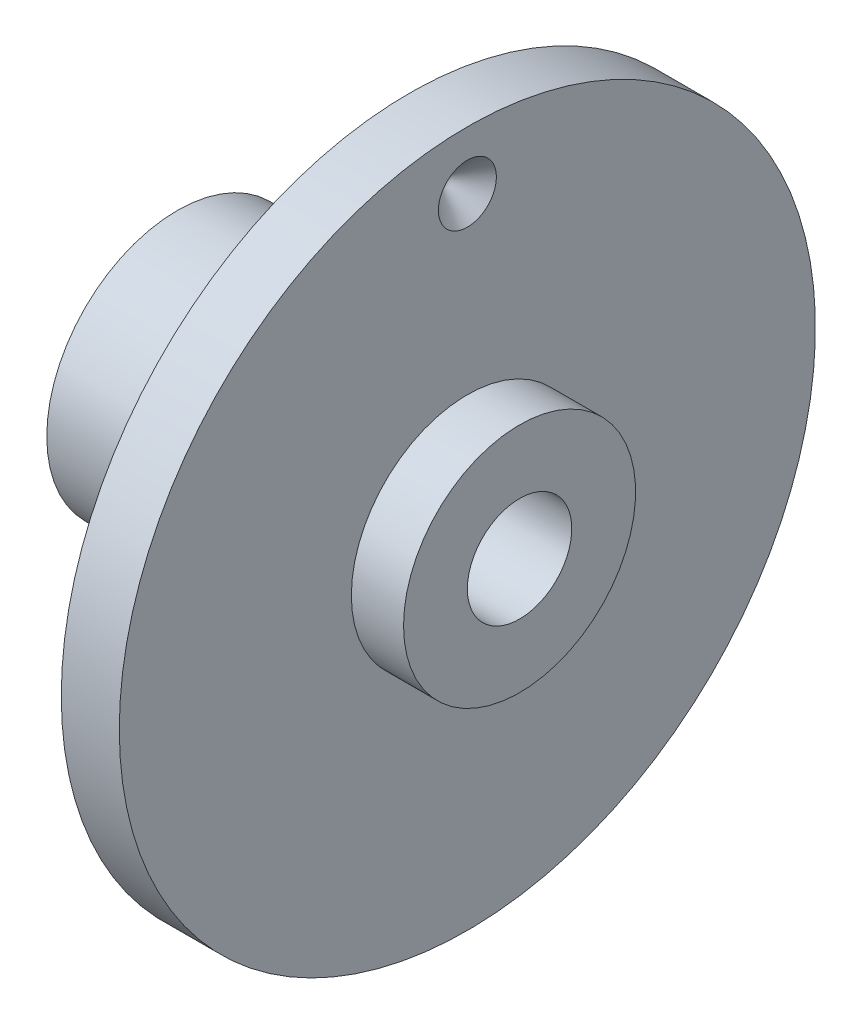
ISO-10303-21;
HEADER;
FILE_DESCRIPTION(('STEP AP214'),'2;1');
FILE_NAME('part.step','',(''),(''),'','','');
FILE_SCHEMA(('AUTOMOTIVE_DESIGN { 1 0 10303 214 1 1 1 1 }'));
ENDSEC;
DATA;
#1=APPLICATION_CONTEXT('core data for automotive mechanical design processes');
#2=APPLICATION_PROTOCOL_DEFINITION('international standard','automotive_design',2000,#1);
#3=PRODUCT_CONTEXT('',#1,'mechanical');
#4=PRODUCT('Part','Part','',(#3));
#5=PRODUCT_RELATED_PRODUCT_CATEGORY('part','',(#4));
#6=PRODUCT_DEFINITION_FORMATION('','',#4);
#7=PRODUCT_DEFINITION_CONTEXT('part definition',#1,'design');
#8=PRODUCT_DEFINITION('design','',#6,#7);
#9=PRODUCT_DEFINITION_SHAPE('','',#8);
#10=(LENGTH_UNIT() NAMED_UNIT(*) SI_UNIT(.MILLI.,.METRE.));
#11=(NAMED_UNIT(*) PLANE_ANGLE_UNIT() SI_UNIT($,.RADIAN.));
#12=(NAMED_UNIT(*) SI_UNIT($,.STERADIAN.) SOLID_ANGLE_UNIT());
#13=UNCERTAINTY_MEASURE_WITH_UNIT(LENGTH_MEASURE(1.E-05),#10,'distance_accuracy_value','');
#14=(GEOMETRIC_REPRESENTATION_CONTEXT(3) GLOBAL_UNCERTAINTY_ASSIGNED_CONTEXT((#13)) GLOBAL_UNIT_ASSIGNED_CONTEXT((#10,
#11,#12)) REPRESENTATION_CONTEXT('',''));
#15=CARTESIAN_POINT('',(0.,0.,0.));
#16=DIRECTION('',(0.,0.,1.));
#17=DIRECTION('',(1.,0.,0.));
#18=AXIS2_PLACEMENT_3D('',#15,#16,#17);
#19=CARTESIAN_POINT('',(50.,20.,0.));
#20=DIRECTION('',(-1.,0.,0.));
#21=DIRECTION('',(0.,0.,1.));
#22=AXIS2_PLACEMENT_3D('',#19,#20,#21);
#23=PLANE('',#22);
#24=CARTESIAN_POINT('',(50.,0.,0.));
#25=DIRECTION('',(-1.,0.,0.));
#26=DIRECTION('',(0.,0.,1.));
#27=AXIS2_PLACEMENT_3D('',#24,#25,#26);
#28=CIRCLE('',#27,20.);
#29=CARTESIAN_POINT('',(50.,0.,20.));
#30=VERTEX_POINT('',#29);
#31=EDGE_CURVE('E77',#30,#30,#28,.T.);
#32=ORIENTED_EDGE('',*,*,#31,.T.);
#33=EDGE_LOOP('',(#32));
#34=FACE_BOUND('',#33,.T.);
#35=CARTESIAN_POINT('',(50.,0.,0.));
#36=DIRECTION('',(-1.,0.,0.));
#37=DIRECTION('',(0.,0.,1.));
#38=AXIS2_PLACEMENT_3D('',#35,#36,#37);
#39=CIRCLE('',#38,60.);
#40=CARTESIAN_POINT('',(50.,0.,60.));
#41=VERTEX_POINT('',#40);
#42=EDGE_CURVE('E80',#41,#41,#39,.T.);
#43=ORIENTED_EDGE('',*,*,#42,.F.);
#44=EDGE_LOOP('',(#43));
#45=FACE_BOUND('',#44,.T.);
#46=CARTESIAN_POINT('',(50.,50.,0.));
#47=DIRECTION('',(-1.,0.,0.));
#48=DIRECTION('',(0.,0.,1.));
#49=AXIS2_PLACEMENT_3D('',#46,#47,#48);
#50=CIRCLE('',#49,5.00000000000002);
#51=CARTESIAN_POINT('',(50.,50.,5.00000000000002));
#52=VERTEX_POINT('',#51);
#53=EDGE_CURVE('E57',#52,#52,#50,.T.);
#54=ORIENTED_EDGE('',*,*,#53,.T.);
#55=EDGE_LOOP('',(#54));
#56=FACE_BOUND('',#55,.T.);
#57=ADVANCED_FACE('F33',(#34,#45,#56),#23,.F.);
#58=CARTESIAN_POINT('',(0.,22.5,0.));
#59=DIRECTION('',(1.,0.,0.));
#60=DIRECTION('',(0.,0.,-1.));
#61=AXIS2_PLACEMENT_3D('',#58,#59,#60);
#62=PLANE('',#61);
#63=CARTESIAN_POINT('',(0.,0.,0.));
#64=DIRECTION('',(-1.,0.,0.));
#65=DIRECTION('',(0.,0.,1.));
#66=AXIS2_PLACEMENT_3D('',#63,#64,#65);
#67=CIRCLE('',#66,9.);
#68=CARTESIAN_POINT('',(0.,0.,9.));
#69=VERTEX_POINT('',#68);
#70=EDGE_CURVE('E59',#69,#69,#67,.T.);
#71=ORIENTED_EDGE('',*,*,#70,.F.);
#72=EDGE_LOOP('',(#71));
#73=FACE_BOUND('',#72,.T.);
#74=CARTESIAN_POINT('',(0.,0.,0.));
#75=DIRECTION('',(-1.,0.,0.));
#76=DIRECTION('',(0.,0.,1.));
#77=AXIS2_PLACEMENT_3D('',#74,#75,#76);
#78=CIRCLE('',#77,22.5);
#79=CARTESIAN_POINT('',(0.,0.,22.5));
#80=VERTEX_POINT('',#79);
#81=EDGE_CURVE('E11',#80,#80,#78,.T.);
#82=ORIENTED_EDGE('',*,*,#81,.T.);
#83=EDGE_LOOP('',(#82));
#84=FACE_BOUND('',#83,.T.);
#85=ADVANCED_FACE('F35',(#73,#84),#62,.F.);
#86=CARTESIAN_POINT('',(-20.,0.,0.));
#87=DIRECTION('',(-1.,0.,0.));
#88=DIRECTION('',(0.,0.,1.));
#89=AXIS2_PLACEMENT_3D('',#86,#87,#88);
#90=CYLINDRICAL_SURFACE('',#89,22.5);
#91=CARTESIAN_POINT('',(15.,13.0770155864555,-18.3096057672359));
#92=CARTESIAN_POINT('',(15.206317442681,13.0770240832661,-18.3096024892956));
#93=CARTESIAN_POINT('',(15.4127485422419,13.0913156939986,-18.2994183770056));
#94=CARTESIAN_POINT('',(15.8198215030235,13.1479095500175,-18.2587962745149));
#95=CARTESIAN_POINT('',(16.0204578014316,13.1902378340962,-18.2283394561028));
#96=CARTESIAN_POINT('',(16.4099908499247,13.3010860565732,-18.1476108211038));
#97=CARTESIAN_POINT('',(16.5988971501429,13.3695843544468,-18.0973553753434));
#98=CARTESIAN_POINT('',(16.9599180256977,13.5300092584372,-17.9777310899457));
#99=CARTESIAN_POINT('',(17.1320345459766,13.6219331464465,-17.9083644677321));
#100=CARTESIAN_POINT('',(17.456263629261,13.8265960596683,-17.750831328497));
#101=CARTESIAN_POINT('',(17.608191644942,13.9395071150623,-17.6625084287029));
#102=CARTESIAN_POINT('',(17.8861286157386,14.1814786120179,-17.4688189267753));
#103=CARTESIAN_POINT('',(18.0121360505088,14.3105400001471,-17.3634513255493));
#104=CARTESIAN_POINT('',(18.2353460137631,14.581076950833,-17.1369033166686));
#105=CARTESIAN_POINT('',(18.3323770337064,14.7226202465386,-17.0156346423206));
#106=CARTESIAN_POINT('',(18.4937776653782,15.0126327467338,-16.7603143368149));
#107=CARTESIAN_POINT('',(18.5581493451186,15.1611015120475,-16.6262635156701));
#108=CARTESIAN_POINT('',(18.6518402571506,15.4587399885508,-16.3498689163775));
#109=CARTESIAN_POINT('',(18.6814694300527,15.6078913968252,-16.2076105327453));
#110=CARTESIAN_POINT('',(18.7057978551124,15.9036103373494,-15.9175394040144));
#111=CARTESIAN_POINT('',(18.7004994213577,16.0501780401345,-15.769727027534));
#112=CARTESIAN_POINT('',(18.6553651482088,16.335150079257,-15.4743208237106));
#113=CARTESIAN_POINT('',(18.6158628500076,16.4736195066431,-15.3267386339208));
#114=CARTESIAN_POINT('',(18.5039671513895,16.7403955457703,-15.0349017055705));
#115=CARTESIAN_POINT('',(18.4315727701256,16.8687018543115,-14.8906470663727));
#116=CARTESIAN_POINT('',(18.2556150521023,17.1128168630976,-14.6094611823209));
#117=CARTESIAN_POINT('',(18.151913864653,17.2285671478913,-14.4725655474654));
#118=CARTESIAN_POINT('',(17.916387176149,17.4446469920346,-14.2113710935762));
#119=CARTESIAN_POINT('',(17.7845594577444,17.544975334525,-14.0870732688286));
#120=CARTESIAN_POINT('',(17.4946707227039,17.7295824285658,-13.8540358489228));
#121=CARTESIAN_POINT('',(17.3363182303917,17.8136576034043,-13.745497370822));
#122=CARTESIAN_POINT('',(16.9988582241053,17.9629552454866,-13.5498130888863));
#123=CARTESIAN_POINT('',(16.8197505283946,18.0281775476335,-13.4626674723922));
#124=CARTESIAN_POINT('',(16.4455371224412,18.138885530931,-13.3131340725564));
#125=CARTESIAN_POINT('',(16.2504145166045,18.1843500411448,-13.2507728523589));
#126=CARTESIAN_POINT('',(15.8498914404862,18.2547937847374,-13.1535600746493));
#127=CARTESIAN_POINT('',(15.6444918513415,18.2797747711677,-13.1187061629751));
#128=CARTESIAN_POINT('',(15.2318037343602,18.3087352429932,-13.0782580661475));
#129=CARTESIAN_POINT('',(15.0245649569782,18.3129555981765,-13.07232830296));
#130=CARTESIAN_POINT('',(14.6118467878029,18.300989058465,-13.0890756500175));
#131=CARTESIAN_POINT('',(14.4063673302222,18.2848029300295,-13.1117516858402));
#132=CARTESIAN_POINT('',(14.0042909537239,18.2324112218292,-13.1845041505863));
#133=CARTESIAN_POINT('',(13.8076472519347,18.1963291417507,-13.2344115272278));
#134=CARTESIAN_POINT('',(13.4273408803059,18.1047212824872,-13.3594550240331));
#135=CARTESIAN_POINT('',(13.2436789692235,18.0491943679217,-13.4345926173745));
#136=CARTESIAN_POINT('',(12.8927337430669,17.918874860787,-13.6079293824515));
#137=CARTESIAN_POINT('',(12.7256124968867,17.8439135744102,-13.7063297850078));
#138=CARTESIAN_POINT('',(12.4141667819037,17.6760719156826,-13.9221090199447));
#139=CARTESIAN_POINT('',(12.2698438737258,17.5831903175904,-14.0394891504411));
#140=CARTESIAN_POINT('',(12.006606618323,17.3799857664735,-14.2902888177677));
#141=CARTESIAN_POINT('',(11.8879638685649,17.2694959940012,-14.423858498618));
#142=CARTESIAN_POINT('',(11.6813557446547,17.0338530464085,-14.7013924810412));
#143=CARTESIAN_POINT('',(11.5933893986387,16.9087003359947,-14.8453564531364));
#144=CARTESIAN_POINT('',(11.4510553453004,16.6470296555412,-15.1381887965232));
#145=CARTESIAN_POINT('',(11.3965446287127,16.5105629314204,-15.2870333867732));
#146=CARTESIAN_POINT('',(11.3222083675264,16.229201519376,-15.585411021046));
#147=CARTESIAN_POINT('',(11.3023800477604,16.084307506734,-15.7349440090254));
#148=CARTESIAN_POINT('',(11.2980496068971,15.791859695965,-16.0283991756575));
#149=CARTESIAN_POINT('',(11.3131339230118,15.6443573667423,-16.1723667094712));
#150=CARTESIAN_POINT('',(11.3773071694616,15.3494116860883,-16.4525666989119));
#151=CARTESIAN_POINT('',(11.4263959215609,15.2019683343519,-16.5887991950783));
#152=CARTESIAN_POINT('',(11.5570275260885,14.9119016999675,-16.8500230258983));
#153=CARTESIAN_POINT('',(11.6385361159006,14.7692735005615,-16.9750260578849));
#154=CARTESIAN_POINT('',(11.8316479048068,14.4932937960975,-17.2112600116402));
#155=CARTESIAN_POINT('',(11.9432524692075,14.359942712242,-17.3224903082735));
#156=CARTESIAN_POINT('',(12.1948583892337,14.1055852106869,-17.530253117919));
#157=CARTESIAN_POINT('',(12.335162952334,13.9847332855396,-17.6266076183421));
#158=CARTESIAN_POINT('',(12.6395494571452,13.7614013710976,-17.8015169671142));
#159=CARTESIAN_POINT('',(12.8036369606224,13.6589256917606,-17.8800676408979));
#160=CARTESIAN_POINT('',(13.1522675953023,13.4756120741957,-18.0186351408299));
#161=CARTESIAN_POINT('',(13.3369434291476,13.394927518573,-18.0785210216367));
#162=CARTESIAN_POINT('',(13.7205354511291,13.2594608778389,-18.1781139446871));
#163=CARTESIAN_POINT('',(13.9194371043724,13.2046527773957,-18.2178412567066));
#164=CARTESIAN_POINT('',(14.2659419653756,13.1351466480632,-18.2679810073743));
#165=CARTESIAN_POINT('',(14.4114409696816,13.1133944102668,-18.2835775753534));
#166=CARTESIAN_POINT('',(14.704607251585,13.0843259629303,-18.3043910386611));
#167=CARTESIAN_POINT('',(14.8522744914763,13.0770095026477,-18.3096081142765));
#168=CARTESIAN_POINT('',(15.,13.0770155864555,-18.3096057672359));
#169=B_SPLINE_CURVE_WITH_KNOTS('',3,(#91,#92,#93,#94,#95,#96,#97,#98,#99,#100,#101,#102,#103,
#104,#105,#106,#107,#108,#109,#110,#111,#112,#113,#114,#115,#116,#117,#118,#119,#120,#121,#122,
#123,#124,#125,#126,#127,#128,#129,#130,#131,#132,#133,#134,#135,#136,#137,#138,#139,#140,#141,
#142,#143,#144,#145,#146,#147,#148,#149,#150,#151,#152,#153,#154,#155,#156,#157,#158,#159,#160,
#161,#162,#163,#164,#165,#166,#167,#168),.UNSPECIFIED.,.T.,.F.,(4,2,2,2,2,2,2,2,2,2,2,2,2,2,2,2,
2,2,2,2,2,2,2,2,2,2,2,2,2,2,2,2,2,2,2,2,2,2,4),(0.,0.618412157836845,1.23739946689154,
1.85587602656153,2.47428085608972,3.09799813808796,3.72175199316601,4.34912776683338,
4.97646380967502,5.59815970109369,6.21981440319192,6.83547441178335,7.45115278065676,
8.06958266629565,8.68806132376408,9.3138454779306,9.93963511199696,10.5660936508093,
11.1924985695138,11.8116183627584,12.4307149028065,13.0460111073609,13.661343244951,
14.2822066476074,14.9031125321063,15.5302950159801,16.1574576281849,16.7819203548402,
17.4063331118279,18.0233872107412,18.6404380753632,19.2568385406833,19.873266973771,
20.4965794869194,21.1200380008822,21.7477768285065,22.3748831972589,22.8176806463992,
23.2604704042915),.UNSPECIFIED.);
#170=CARTESIAN_POINT('',(15.,13.0770155864555,-18.3096057672359));
#171=VERTEX_POINT('',#170);
#172=EDGE_CURVE('E60',#171,#171,#169,.T.);
#173=ORIENTED_EDGE('',*,*,#172,.T.);
#174=EDGE_LOOP('',(#173));
#175=FACE_BOUND('',#174,.T.);
#176=CARTESIAN_POINT('',(15.,-18.309605767236,13.0770155864555));
#177=CARTESIAN_POINT('',(14.793682557319,-18.3096024892956,13.0770240832661));
#178=CARTESIAN_POINT('',(14.587251457758,-18.2994183770056,13.0913156939985));
#179=CARTESIAN_POINT('',(14.1801784969765,-18.258796274515,13.1479095500174));
#180=CARTESIAN_POINT('',(13.9795421985684,-18.2283394561029,13.1902378340962));
#181=CARTESIAN_POINT('',(13.5900091500753,-18.1476108211039,13.3010860565731));
#182=CARTESIAN_POINT('',(13.4011028498571,-18.0973553753434,13.3695843544468));
#183=CARTESIAN_POINT('',(13.0400819743023,-17.9777310899457,13.5300092584371));
#184=CARTESIAN_POINT('',(12.8679654540234,-17.9083644677321,13.6219331464464));
#185=CARTESIAN_POINT('',(12.543736370739,-17.7508313284971,13.8265960596682));
#186=CARTESIAN_POINT('',(12.391808355058,-17.6625084287029,13.9395071150622));
#187=CARTESIAN_POINT('',(12.1138713842613,-17.4688189267753,14.1814786120178));
#188=CARTESIAN_POINT('',(11.9878639494912,-17.3634513255494,14.3105400001471));
#189=CARTESIAN_POINT('',(11.7646539862369,-17.1369033166686,14.581076950833));
#190=CARTESIAN_POINT('',(11.6676229662936,-17.0156346423207,14.7226202465386));
#191=CARTESIAN_POINT('',(11.5062223346218,-16.760314336815,15.0126327467337));
#192=CARTESIAN_POINT('',(11.4418506548814,-16.6262635156702,15.1611015120475));
#193=CARTESIAN_POINT('',(11.3481597428494,-16.3498689163776,15.4587399885507));
#194=CARTESIAN_POINT('',(11.3185305699473,-16.2076105327454,15.6078913968251));
#195=CARTESIAN_POINT('',(11.2942021448876,-15.9175394040144,15.9036103373493));
#196=CARTESIAN_POINT('',(11.2995005786423,-15.7697270275341,16.0501780401344));
#197=CARTESIAN_POINT('',(11.3446348517912,-15.4743208237106,16.3351500792569));
#198=CARTESIAN_POINT('',(11.3841371499924,-15.3267386339209,16.473619506643));
#199=CARTESIAN_POINT('',(11.4960328486105,-15.0349017055705,16.7403955457702));
#200=CARTESIAN_POINT('',(11.5684272298744,-14.8906470663728,16.8687018543115));
#201=CARTESIAN_POINT('',(11.7443849478977,-14.6094611823209,17.1128168630975));
#202=CARTESIAN_POINT('',(11.848086135347,-14.4725655474655,17.2285671478912));
#203=CARTESIAN_POINT('',(12.083612823851,-14.2113710935762,17.4446469920346));
#204=CARTESIAN_POINT('',(12.2154405422556,-14.0870732688286,17.5449753345249));
#205=CARTESIAN_POINT('',(12.5053292772961,-13.8540358489228,17.7295824285658));
#206=CARTESIAN_POINT('',(12.6636817696083,-13.745497370822,17.8136576034043));
#207=CARTESIAN_POINT('',(13.0011417758947,-13.5498130888863,17.9629552454865));
#208=CARTESIAN_POINT('',(13.1802494716054,-13.4626674723923,18.0281775476335));
#209=CARTESIAN_POINT('',(13.5544628775588,-13.3131340725565,18.138885530931));
#210=CARTESIAN_POINT('',(13.7495854833955,-13.250772852359,18.1843500411447));
#211=CARTESIAN_POINT('',(14.1501085595138,-13.1535600746493,18.2547937847373));
#212=CARTESIAN_POINT('',(14.3555081486585,-13.1187061629751,18.2797747711677));
#213=CARTESIAN_POINT('',(14.7681962656398,-13.0782580661475,18.3087352429931));
#214=CARTESIAN_POINT('',(14.9754350430218,-13.0723283029601,18.3129555981764));
#215=CARTESIAN_POINT('',(15.3881532121971,-13.0890756500176,18.3009890584649));
#216=CARTESIAN_POINT('',(15.5936326697779,-13.1117516858403,18.2848029300294));
#217=CARTESIAN_POINT('',(15.9957090462761,-13.1845041505863,18.2324112218292));
#218=CARTESIAN_POINT('',(16.1923527480653,-13.2344115272279,18.1963291417506));
#219=CARTESIAN_POINT('',(16.5726591196941,-13.3594550240332,18.1047212824872));
#220=CARTESIAN_POINT('',(16.7563210307765,-13.4345926173746,18.0491943679217));
#221=CARTESIAN_POINT('',(17.1072662569331,-13.6079293824516,17.918874860787));
#222=CARTESIAN_POINT('',(17.2743875031133,-13.7063297850079,17.8439135744102));
#223=CARTESIAN_POINT('',(17.5858332180963,-13.9221090199448,17.6760719156825));
#224=CARTESIAN_POINT('',(17.7301561262742,-14.0394891504412,17.5831903175904));
#225=CARTESIAN_POINT('',(17.993393381677,-14.2902888177677,17.3799857664734));
#226=CARTESIAN_POINT('',(18.1120361314351,-14.4238584986181,17.2694959940012));
#227=CARTESIAN_POINT('',(18.3186442553453,-14.7013924810412,17.0338530464085));
#228=CARTESIAN_POINT('',(18.4066106013613,-14.8453564531365,16.9087003359947));
#229=CARTESIAN_POINT('',(18.5489446546996,-15.1381887965233,16.6470296555411));
#230=CARTESIAN_POINT('',(18.6034553712873,-15.2870333867733,16.5105629314204));
#231=CARTESIAN_POINT('',(18.6777916324736,-15.5854110210461,16.2292015193759));
#232=CARTESIAN_POINT('',(18.6976199522396,-15.7349440090255,16.0843075067339));
#233=CARTESIAN_POINT('',(18.7019503931029,-16.0283991756575,15.7918596959649));
#234=CARTESIAN_POINT('',(18.6868660769882,-16.1723667094713,15.6443573667422));
#235=CARTESIAN_POINT('',(18.6226928305384,-16.452566698912,15.3494116860882));
#236=CARTESIAN_POINT('',(18.5736040784391,-16.5887991950784,15.2019683343518));
#237=CARTESIAN_POINT('',(18.4429724739115,-16.8500230258984,14.9119016999674));
#238=CARTESIAN_POINT('',(18.3614638840994,-16.975026057885,14.7692735005614));
#239=CARTESIAN_POINT('',(18.1683520951932,-17.2112600116403,14.4932937960974));
#240=CARTESIAN_POINT('',(18.0567475307925,-17.3224903082735,14.359942712242));
#241=CARTESIAN_POINT('',(17.8051416107663,-17.530253117919,14.1055852106868));
#242=CARTESIAN_POINT('',(17.664837047666,-17.6266076183421,13.9847332855395));
#243=CARTESIAN_POINT('',(17.3604505428548,-17.8015169671143,13.7614013710976));
#244=CARTESIAN_POINT('',(17.1963630393776,-17.8800676408979,13.6589256917605));
#245=CARTESIAN_POINT('',(16.8477324046977,-18.0186351408299,13.4756120741956));
#246=CARTESIAN_POINT('',(16.6630565708524,-18.0785210216367,13.3949275185729));
#247=CARTESIAN_POINT('',(16.2794645488709,-18.1781139446871,13.2594608778388));
#248=CARTESIAN_POINT('',(16.0805628956276,-18.2178412567066,13.2046527773956));
#249=CARTESIAN_POINT('',(15.7340580346244,-18.2679810073743,13.1351466480631));
#250=CARTESIAN_POINT('',(15.5885590303184,-18.2835775753535,13.1133944102667));
#251=CARTESIAN_POINT('',(15.295392748415,-18.3043910386611,13.0843259629302));
#252=CARTESIAN_POINT('',(15.1477255085237,-18.3096081142765,13.0770095026477));
#253=CARTESIAN_POINT('',(15.,-18.309605767236,13.0770155864555));
#254=B_SPLINE_CURVE_WITH_KNOTS('',3,(#176,#177,#178,#179,#180,#181,#182,#183,#184,#185,#186,
#187,#188,#189,#190,#191,#192,#193,#194,#195,#196,#197,#198,#199,#200,#201,#202,#203,#204,#205,
#206,#207,#208,#209,#210,#211,#212,#213,#214,#215,#216,#217,#218,#219,#220,#221,#222,#223,#224,
#225,#226,#227,#228,#229,#230,#231,#232,#233,#234,#235,#236,#237,#238,#239,#240,#241,#242,#243,
#244,#245,#246,#247,#248,#249,#250,#251,#252,#253),.UNSPECIFIED.,.T.,.F.,(4,2,2,2,2,2,2,2,2,2,2,
2,2,2,2,2,2,2,2,2,2,2,2,2,2,2,2,2,2,2,2,2,2,2,2,2,2,2,4),(0.,0.618412157836845,1.23739946689155,
1.85587602656153,2.47428085608972,3.09799813808797,3.72175199316601,4.34912776683338,
4.97646380967502,5.59815970109369,6.21981440319192,6.83547441178336,7.45115278065676,
8.06958266629565,8.68806132376409,9.31384547793061,9.93963511199696,10.5660936508093,
11.1924985695138,11.8116183627584,12.4307149028065,13.0460111073609,13.661343244951,
14.2822066476074,14.9031125321064,15.5302950159801,16.1574576281849,16.7819203548402,
17.4063331118279,18.0233872107412,18.6404380753632,19.2568385406833,19.873266973771,
20.4965794869194,21.1200380008822,21.7477768285065,22.3748831972589,22.8176806463992,
23.2604704042915),.UNSPECIFIED.);
#255=CARTESIAN_POINT('',(15.,-18.309605767236,13.0770155864555));
#256=VERTEX_POINT('',#255);
#257=EDGE_CURVE('E66',#256,#256,#254,.T.);
#258=ORIENTED_EDGE('',*,*,#257,.T.);
#259=EDGE_LOOP('',(#258));
#260=FACE_BOUND('',#259,.T.);
#261=ORIENTED_EDGE('',*,*,#81,.F.);
#262=EDGE_LOOP('',(#261));
#263=FACE_BOUND('',#262,.T.);
#264=CARTESIAN_POINT('',(40.,0.,0.));
#265=DIRECTION('',(-1.,0.,0.));
#266=DIRECTION('',(0.,0.,1.));
#267=AXIS2_PLACEMENT_3D('',#264,#265,#266);
#268=CIRCLE('',#267,22.5);
#269=CARTESIAN_POINT('',(40.,0.,22.5));
#270=VERTEX_POINT('',#269);
#271=EDGE_CURVE('E45',#270,#270,#268,.T.);
#272=ORIENTED_EDGE('',*,*,#271,.T.);
#273=EDGE_LOOP('',(#272));
#274=FACE_BOUND('',#273,.T.);
#275=ADVANCED_FACE('F103',(#175,#260,#263,#274),#90,.T.);
#276=CARTESIAN_POINT('',(40.,60.,0.));
#277=DIRECTION('',(1.,0.,0.));
#278=DIRECTION('',(0.,0.,-1.));
#279=AXIS2_PLACEMENT_3D('',#276,#277,#278);
#280=PLANE('',#279);
#281=ORIENTED_EDGE('',*,*,#271,.F.);
#282=EDGE_LOOP('',(#281));
#283=FACE_BOUND('',#282,.T.);
#284=CARTESIAN_POINT('',(40.,0.,0.));
#285=DIRECTION('',(-1.,0.,0.));
#286=DIRECTION('',(0.,0.,1.));
#287=AXIS2_PLACEMENT_3D('',#284,#285,#286);
#288=CIRCLE('',#287,60.);
#289=CARTESIAN_POINT('',(40.,0.,60.));
#290=VERTEX_POINT('',#289);
#291=EDGE_CURVE('E83',#290,#290,#288,.T.);
#292=ORIENTED_EDGE('',*,*,#291,.T.);
#293=EDGE_LOOP('',(#292));
#294=FACE_BOUND('',#293,.T.);
#295=ADVANCED_FACE('F107',(#283,#294),#280,.F.);
#296=CARTESIAN_POINT('',(-20.,0.,0.));
#297=DIRECTION('',(-1.,0.,0.));
#298=DIRECTION('',(0.,0.,1.));
#299=AXIS2_PLACEMENT_3D('',#296,#297,#298);
#300=CYLINDRICAL_SURFACE('',#299,60.);
#301=ORIENTED_EDGE('',*,*,#291,.F.);
#302=EDGE_LOOP('',(#301));
#303=FACE_BOUND('',#302,.T.);
#304=ORIENTED_EDGE('',*,*,#42,.T.);
#305=EDGE_LOOP('',(#304));
#306=FACE_BOUND('',#305,.T.);
#307=ADVANCED_FACE('F112',(#303,#306),#300,.T.);
#308=CARTESIAN_POINT('',(-20.,0.,0.));
#309=DIRECTION('',(-1.,0.,0.));
#310=DIRECTION('',(0.,0.,1.));
#311=AXIS2_PLACEMENT_3D('',#308,#309,#310);
#312=CYLINDRICAL_SURFACE('',#311,20.);
#313=ORIENTED_EDGE('',*,*,#31,.F.);
#314=EDGE_LOOP('',(#313));
#315=FACE_BOUND('',#314,.T.);
#316=CARTESIAN_POINT('',(59.,0.,0.));
#317=DIRECTION('',(-1.,0.,0.));
#318=DIRECTION('',(0.,0.,1.));
#319=AXIS2_PLACEMENT_3D('',#316,#317,#318);
#320=CIRCLE('',#319,20.);
#321=CARTESIAN_POINT('',(59.,0.,20.));
#322=VERTEX_POINT('',#321);
#323=EDGE_CURVE('E74',#322,#322,#320,.T.);
#324=ORIENTED_EDGE('',*,*,#323,.T.);
#325=EDGE_LOOP('',(#324));
#326=FACE_BOUND('',#325,.T.);
#327=ADVANCED_FACE('F116',(#315,#326),#312,.T.);
#328=CARTESIAN_POINT('',(59.,9.,0.));
#329=DIRECTION('',(-1.,0.,0.));
#330=DIRECTION('',(0.,0.,1.));
#331=AXIS2_PLACEMENT_3D('',#328,#329,#330);
#332=PLANE('',#331);
#333=ORIENTED_EDGE('',*,*,#323,.F.);
#334=EDGE_LOOP('',(#333));
#335=FACE_BOUND('',#334,.T.);
#336=CARTESIAN_POINT('',(59.,0.,0.));
#337=DIRECTION('',(-1.,0.,0.));
#338=DIRECTION('',(0.,0.,1.));
#339=AXIS2_PLACEMENT_3D('',#336,#337,#338);
#340=CIRCLE('',#339,9.);
#341=CARTESIAN_POINT('',(59.,0.,9.));
#342=VERTEX_POINT('',#341);
#343=EDGE_CURVE('E63',#342,#342,#340,.T.);
#344=ORIENTED_EDGE('',*,*,#343,.T.);
#345=EDGE_LOOP('',(#344));
#346=FACE_BOUND('',#345,.T.);
#347=ADVANCED_FACE('F122',(#335,#346),#332,.F.);
#348=CARTESIAN_POINT('',(-20.,0.,0.));
#349=DIRECTION('',(-1.,0.,0.));
#350=DIRECTION('',(0.,0.,1.));
#351=AXIS2_PLACEMENT_3D('',#348,#349,#350);
#352=CYLINDRICAL_SURFACE('',#351,9.);
#353=CARTESIAN_POINT('',(15.,3.18499786894222,-8.41758804972265));
#354=CARTESIAN_POINT('',(14.9011475929728,3.18499882740954,-8.41758805246942));
#355=CARTESIAN_POINT('',(14.8022582332306,3.18907108420273,-8.41605034621855));
#356=CARTESIAN_POINT('',(14.605197917127,3.20528953234659,-8.40988654614687));
#357=CARTESIAN_POINT('',(14.5070274815042,3.2174410841215,-8.40525840188355));
#358=CARTESIAN_POINT('',(14.3119639449789,3.24963804241891,-8.39286314716957));
#359=CARTESIAN_POINT('',(14.2150740628428,3.26970045080468,-8.38508927503006));
#360=CARTESIAN_POINT('',(14.0234684931534,3.31736038984353,-8.36634736420008));
#361=CARTESIAN_POINT('',(13.9287537371158,3.34496108591737,-8.35537798354667));
#362=CARTESIAN_POINT('',(13.6496679996886,3.43815509801652,-8.31766887699975));
#363=CARTESIAN_POINT('',(13.469348896175,3.51431279496357,-8.28606648166136));
#364=CARTESIAN_POINT('',(13.1242006917912,3.69044636210314,-8.20912813865535));
#365=CARTESIAN_POINT('',(12.9593676550179,3.79041615730755,-8.16379569302475));
#366=CARTESIAN_POINT('',(12.6396650701036,4.01561570358758,-8.05551095441443));
#367=CARTESIAN_POINT('',(12.4858391016613,4.14193080212685,-7.99172806529398));
#368=CARTESIAN_POINT('',(12.2021502531006,4.41053240626399,-7.84668640890526));
#369=CARTESIAN_POINT('',(12.0722964706331,4.55282494262527,-7.76542103211287));
#370=CARTESIAN_POINT('',(11.8349497397696,4.8540830296308,-7.58091830436001));
#371=CARTESIAN_POINT('',(11.7286259603981,5.0134979777764,-7.4769010493569));
#372=CARTESIAN_POINT('',(11.5492739978725,5.33712587102389,-7.24942184610302));
#373=CARTESIAN_POINT('',(11.4762314051201,5.50133670684035,-7.1259683442841));
#374=CARTESIAN_POINT('',(11.3692817635219,5.81952180258586,-6.86825463369854));
#375=CARTESIAN_POINT('',(11.3335744455423,5.97359217317019,-6.73486249552093));
#376=CARTESIAN_POINT('',(11.2964988088559,6.27433823322002,-6.45559620799709));
#377=CARTESIAN_POINT('',(11.2951169501005,6.42101681566979,-6.30972700314974));
#378=CARTESIAN_POINT('',(11.3257733344204,6.69383080605871,-6.01913798553653));
#379=CARTESIAN_POINT('',(11.355835417698,6.8206685553565,-5.87486257641264));
#380=CARTESIAN_POINT('',(11.4451476429593,7.06071995219,-5.58406639223186));
#381=CARTESIAN_POINT('',(11.5043999334594,7.17393259609992,-5.43754545266418));
#382=CARTESIAN_POINT('',(11.6511241741315,7.38671494838604,-5.14487163955663));
#383=CARTESIAN_POINT('',(11.7390116453084,7.48605095168807,-4.99875826245311));
#384=CARTESIAN_POINT('',(11.9401105615785,7.66853487156769,-4.71404403952693));
#385=CARTESIAN_POINT('',(12.0533308741711,7.75167710057368,-4.57544584547279));
#386=CARTESIAN_POINT('',(12.3109569092543,7.90727685278261,-4.30133692188821));
#387=CARTESIAN_POINT('',(12.4569734038393,7.97860410561326,-4.16669627275099));
#388=CARTESIAN_POINT('',(12.7714840162414,8.10412330785852,-3.9169835198212));
#389=CARTESIAN_POINT('',(12.9399863167125,8.15830899509449,-3.80191857452883));
#390=CARTESIAN_POINT('',(13.3013600170428,8.25214691147949,-3.59382018055307));
#391=CARTESIAN_POINT('',(13.494828709245,8.29129165144557,-3.50158824130234));
#392=CARTESIAN_POINT('',(13.896617737774,8.3537019985286,-3.34999451569395));
#393=CARTESIAN_POINT('',(14.1049276705345,8.37697861040967,-3.29060995463192));
#394=CARTESIAN_POINT('',(14.5163318457503,8.40746617844982,-3.21188331670624));
#395=CARTESIAN_POINT('',(14.7189144140069,8.41560524162002,-3.19023354544937));
#396=CARTESIAN_POINT('',(15.1249009466393,8.41893085738366,-3.18145338328819));
#397=CARTESIAN_POINT('',(15.3283046168717,8.41412169726066,-3.19431156645758));
#398=CARTESIAN_POINT('',(15.7169675824609,8.39211245921054,-3.2516565876836));
#399=CARTESIAN_POINT('',(15.9025727554948,8.37569388865635,-3.29414636524478));
#400=CARTESIAN_POINT('',(16.2640170421091,8.33089197434899,-3.40585280121336));
#401=CARTESIAN_POINT('',(16.4398539022774,8.30250588272257,-3.47507559750637));
#402=CARTESIAN_POINT('',(16.7849737120761,8.23162735295725,-3.63986984819939));
#403=CARTESIAN_POINT('',(16.9536759694607,8.18859513764826,-3.73642125310462));
#404=CARTESIAN_POINT('',(17.2729201846234,8.08783286183139,-3.94979313133349));
#405=CARTESIAN_POINT('',(17.4234543906405,8.03009655997937,-4.06662220505874));
#406=CARTESIAN_POINT('',(17.7144365564341,7.89377055464707,-4.32567028975086));
#407=CARTESIAN_POINT('',(17.8531535189184,7.81389560309056,-4.46916488732407));
#408=CARTESIAN_POINT('',(18.1024105592951,7.63503688445077,-4.76828524740524));
#409=CARTESIAN_POINT('',(18.2129488938808,7.53605193576864,-4.92391175969217));
#410=CARTESIAN_POINT('',(18.40248697768,7.31880615677381,-5.24138169357244));
#411=CARTESIAN_POINT('',(18.4814371081126,7.20051540799513,-5.40323446169646));
#412=CARTESIAN_POINT('',(18.604335994744,6.94629611637408,-5.72635330347947));
#413=CARTESIAN_POINT('',(18.6483049686037,6.81037781443827,-5.887619662327));
#414=CARTESIAN_POINT('',(18.6974965081889,6.5340596981982,-6.19237179463905));
#415=CARTESIAN_POINT('',(18.7051619318979,6.3946011339209,-6.33631948571189));
#416=CARTESIAN_POINT('',(18.6880569877836,6.10739282366051,-6.61358966812975));
#417=CARTESIAN_POINT('',(18.6632920437289,5.95964446804639,-6.7469139322183));
#418=CARTESIAN_POINT('',(18.5837817350078,5.66591277905341,-6.99522776911045));
#419=CARTESIAN_POINT('',(18.5300793203706,5.52003892452192,-7.11068512779947));
#420=CARTESIAN_POINT('',(18.3953413592753,5.22992701143678,-7.32670495456297));
#421=CARTESIAN_POINT('',(18.3143005511296,5.08568927330637,-7.42726454997141));
#422=CARTESIAN_POINT('',(18.123107618869,4.79717874332433,-7.61696952350733));
#423=CARTESIAN_POINT('',(18.0118114172288,4.65319537444373,-7.70539933837755));
#424=CARTESIAN_POINT('',(17.7649418774701,4.37717830557398,-7.86548217916267));
#425=CARTESIAN_POINT('',(17.6293598268395,4.24514891973334,-7.93712916290451));
#426=CARTESIAN_POINT('',(17.3272520058056,3.9898772601615,-8.06863321251623));
#427=CARTESIAN_POINT('',(17.1592755377771,3.86778806401574,-8.12740166412387));
#428=CARTESIAN_POINT('',(16.8027034370005,3.64880470346937,-8.22805104284453));
#429=CARTESIAN_POINT('',(16.6140965248959,3.55192442041258,-8.26992267264551));
#430=CARTESIAN_POINT('',(16.3202904474676,3.43033426384833,-8.32073925647533));
#431=CARTESIAN_POINT('',(16.2208373353704,3.39382971741448,-8.33565407998709));
#432=CARTESIAN_POINT('',(16.0187930942232,3.32914926053759,-8.36169761600191));
#433=CARTESIAN_POINT('',(15.9162035233585,3.30096928634154,-8.3728281762463));
#434=CARTESIAN_POINT('',(15.7089495379618,3.25354116953849,-8.39137155674294));
#435=CARTESIAN_POINT('',(15.6042913827351,3.23426941961156,-8.39879420744075));
#436=CARTESIAN_POINT('',(15.3935517003654,3.20495042787695,-8.41002632691972));
#437=CARTESIAN_POINT('',(15.2874713542085,3.1948959616508,-8.41383862553774));
#438=CARTESIAN_POINT('',(15.1509995390237,3.1880332079396,-8.41643895259481));
#439=CARTESIAN_POINT('',(15.1208136165114,3.18689538193739,-8.41686986895195));
#440=CARTESIAN_POINT('',(15.0604196132876,3.18537756348061,-8.41744441804135));
#441=CARTESIAN_POINT('',(15.0302115324315,3.18499757601291,-8.41758804888318));
#442=CARTESIAN_POINT('',(15.,3.18499786894222,-8.41758804972265));
#443=B_SPLINE_CURVE_WITH_KNOTS('',3,(#353,#354,#355,#356,#357,#358,#359,#360,#361,#362,#363,
#364,#365,#366,#367,#368,#369,#370,#371,#372,#373,#374,#375,#376,#377,#378,#379,#380,#381,#382,
#383,#384,#385,#386,#387,#388,#389,#390,#391,#392,#393,#394,#395,#396,#397,#398,#399,#400,#401,
#402,#403,#404,#405,#406,#407,#408,#409,#410,#411,#412,#413,#414,#415,#416,#417,#418,#419,#420,
#421,#422,#423,#424,#425,#426,#427,#428,#429,#430,#431,#432,#433,#434,#435,#436,#437,#438,#439,
#440,#441,#442),.UNSPECIFIED.,.T.,.F.,(4,2,2,2,2,2,2,2,2,2,2,2,2,2,2,2,2,2,2,2,2,2,2,2,2,2,2,2,
2,2,2,2,2,2,2,2,2,2,2,2,2,2,2,2,4),(0.,0.296525464497516,0.593247863326003,0.890611478877414,
1.18810015359895,1.7800467081416,2.3718424055925,2.99612295749451,3.62063994437269,
4.27140451216297,4.9218870531255,5.53931113022278,6.15649165384687,6.73708808822313,
7.31772726321364,7.90719812817875,8.49687565502862,9.12716599655278,9.75768633135402,
10.4079246020212,11.0577114635368,11.6661478671665,12.2743828363202,12.8451515531303,
13.4160513960937,14.0108016770764,14.6058048296669,15.247720059301,15.8896749922041,
16.53263438649,17.1752219063482,17.7738895147351,18.372457012635,18.9507679818336,
19.5291903192955,20.133593318143,20.73821358152,21.3826928255592,22.0275262060836,
22.3481242412792,22.6685655125787,22.9881526572144,23.3074890978158,23.3981133932384,
23.4887382850022),.UNSPECIFIED.);
#444=CARTESIAN_POINT('',(15.,3.18499786894222,-8.41758804972265));
#445=VERTEX_POINT('',#444);
#446=EDGE_CURVE('E37',#445,#445,#443,.T.);
#447=ORIENTED_EDGE('',*,*,#446,.T.);
#448=EDGE_LOOP('',(#447));
#449=FACE_BOUND('',#448,.T.);
#450=CARTESIAN_POINT('',(15.,-8.41758804972266,3.18499786894218));
#451=CARTESIAN_POINT('',(15.0988524070272,-8.41758805246943,3.1849988274095));
#452=CARTESIAN_POINT('',(15.1977417667694,-8.41605034621856,3.18907108420269));
#453=CARTESIAN_POINT('',(15.394802082873,-8.40988654614688,3.20528953234656));
#454=CARTESIAN_POINT('',(15.4929725184958,-8.40525840188356,3.21744108412147));
#455=CARTESIAN_POINT('',(15.6880360550211,-8.39286314716958,3.24963804241889));
#456=CARTESIAN_POINT('',(15.7849259371572,-8.38508927503008,3.26970045080466));
#457=CARTESIAN_POINT('',(15.9765315068466,-8.3663473642001,3.31736038984351));
#458=CARTESIAN_POINT('',(16.0712462628842,-8.35537798354668,3.34496108591733));
#459=CARTESIAN_POINT('',(16.3503320003114,-8.31766887699976,3.43815509801648));
#460=CARTESIAN_POINT('',(16.530651103825,-8.28606648166137,3.51431279496353));
#461=CARTESIAN_POINT('',(16.8757993082088,-8.20912813865536,3.69044636210311));
#462=CARTESIAN_POINT('',(17.0406323449821,-8.16379569302476,3.79041615730752));
#463=CARTESIAN_POINT('',(17.3603349298964,-8.05551095441445,4.01561570358755));
#464=CARTESIAN_POINT('',(17.5141608983387,-7.991728065294,4.14193080212682));
#465=CARTESIAN_POINT('',(17.7978497468994,-7.84668640890528,4.41053240626396));
#466=CARTESIAN_POINT('',(17.9277035293668,-7.76542103211289,4.55282494262524));
#467=CARTESIAN_POINT('',(18.1650502602303,-7.58091830436003,4.85408302963077));
#468=CARTESIAN_POINT('',(18.2713740396019,-7.47690104935692,5.01349797777637));
#469=CARTESIAN_POINT('',(18.4507260021275,-7.24942184610304,5.33712587102386));
#470=CARTESIAN_POINT('',(18.5237685948799,-7.12596834428413,5.50133670684032));
#471=CARTESIAN_POINT('',(18.6307182364781,-6.86825463369856,5.81952180258583));
#472=CARTESIAN_POINT('',(18.6664255544577,-6.73486249552096,5.97359217317016));
#473=CARTESIAN_POINT('',(18.7035011911441,-6.45559620799712,6.27433823322));
#474=CARTESIAN_POINT('',(18.7048830498995,-6.30972700314977,6.42101681566977));
#475=CARTESIAN_POINT('',(18.6742266655796,-6.01913798553655,6.69383080605869));
#476=CARTESIAN_POINT('',(18.644164582302,-5.87486257641267,6.82066855535648));
#477=CARTESIAN_POINT('',(18.5548523570407,-5.58406639223189,7.06071995218998));
#478=CARTESIAN_POINT('',(18.4956000665406,-5.4375454526642,7.1739325960999));
#479=CARTESIAN_POINT('',(18.3488758258685,-5.14487163955666,7.38671494838602));
#480=CARTESIAN_POINT('',(18.2609883546916,-4.99875826245314,7.48605095168806));
#481=CARTESIAN_POINT('',(18.0598894384215,-4.71404403952696,7.66853487156767));
#482=CARTESIAN_POINT('',(17.9466691258289,-4.57544584547282,7.75167710057367));
#483=CARTESIAN_POINT('',(17.6890430907457,-4.30133692188824,7.90727685278259));
#484=CARTESIAN_POINT('',(17.5430265961607,-4.16669627275102,7.97860410561325));
#485=CARTESIAN_POINT('',(17.2285159837586,-3.91698351982123,8.1041233078585));
#486=CARTESIAN_POINT('',(17.0600136832875,-3.80191857452886,8.15830899509447));
#487=CARTESIAN_POINT('',(16.6986399829572,-3.59382018055311,8.25214691147948));
#488=CARTESIAN_POINT('',(16.505171290755,-3.50158824130237,8.29129165144556));
#489=CARTESIAN_POINT('',(16.103382262226,-3.34999451569398,8.35370199852859));
#490=CARTESIAN_POINT('',(15.8950723294655,-3.29060995463194,8.37697861040966));
#491=CARTESIAN_POINT('',(15.4836681542497,-3.21188331670627,8.4074661784498));
#492=CARTESIAN_POINT('',(15.281085585993,-3.1902335454494,8.41560524162001));
#493=CARTESIAN_POINT('',(14.8750990533607,-3.18145338328822,8.41893085738364));
#494=CARTESIAN_POINT('',(14.6716953831283,-3.19431156645761,8.41412169726065));
#495=CARTESIAN_POINT('',(14.2830324175391,-3.25165658768362,8.39211245921053));
#496=CARTESIAN_POINT('',(14.0974272445052,-3.29414636524481,8.37569388865634));
#497=CARTESIAN_POINT('',(13.7359829578909,-3.40585280121339,8.33089197434898));
#498=CARTESIAN_POINT('',(13.5601460977226,-3.4750755975064,8.30250588272256));
#499=CARTESIAN_POINT('',(13.2150262879239,-3.63986984819942,8.23162735295723));
#500=CARTESIAN_POINT('',(13.0463240305393,-3.73642125310465,8.18859513764824));
#501=CARTESIAN_POINT('',(12.7270798153766,-3.94979313133352,8.08783286183137));
#502=CARTESIAN_POINT('',(12.5765456093595,-4.06662220505878,8.03009655997936));
#503=CARTESIAN_POINT('',(12.2855634435659,-4.32567028975089,7.89377055464705));
#504=CARTESIAN_POINT('',(12.1468464810816,-4.46916488732409,7.81389560309055));
#505=CARTESIAN_POINT('',(11.8975894407049,-4.76828524740527,7.63503688445075));
#506=CARTESIAN_POINT('',(11.7870511061192,-4.92391175969219,7.53605193576862));
#507=CARTESIAN_POINT('',(11.59751302232,-5.24138169357246,7.3188061567738));
#508=CARTESIAN_POINT('',(11.5185628918874,-5.40323446169648,7.20051540799511));
#509=CARTESIAN_POINT('',(11.395664005256,-5.72635330347949,6.94629611637406));
#510=CARTESIAN_POINT('',(11.3516950313963,-5.88761966232703,6.81037781443825));
#511=CARTESIAN_POINT('',(11.3025034918111,-6.19237179463907,6.53405969819818));
#512=CARTESIAN_POINT('',(11.2948380681021,-6.33631948571191,6.39460113392088));
#513=CARTESIAN_POINT('',(11.3119430122164,-6.61358966812977,6.10739282366048));
#514=CARTESIAN_POINT('',(11.3367079562711,-6.74691393221832,5.95964446804637));
#515=CARTESIAN_POINT('',(11.4162182649922,-6.99522776911047,5.66591277905338));
#516=CARTESIAN_POINT('',(11.4699206796294,-7.11068512779949,5.52003892452189));
#517=CARTESIAN_POINT('',(11.6046586407247,-7.32670495456299,5.22992701143675));
#518=CARTESIAN_POINT('',(11.6856994488704,-7.42726454997143,5.08568927330635));
#519=CARTESIAN_POINT('',(11.876892381131,-7.61696952350735,4.79717874332431));
#520=CARTESIAN_POINT('',(11.9881885827712,-7.70539933837757,4.6531953744437));
#521=CARTESIAN_POINT('',(12.2350581225299,-7.86548217916269,4.37717830557395));
#522=CARTESIAN_POINT('',(12.3706401731605,-7.93712916290452,4.24514891973331));
#523=CARTESIAN_POINT('',(12.6727479941944,-8.06863321251624,3.98987726016147));
#524=CARTESIAN_POINT('',(12.8407244622229,-8.12740166412388,3.86778806401572));
#525=CARTESIAN_POINT('',(13.1972965629995,-8.22805104284454,3.64880470346934));
#526=CARTESIAN_POINT('',(13.3859034751041,-8.26992267264552,3.55192442041255));
#527=CARTESIAN_POINT('',(13.6797095525324,-8.32073925647534,3.4303342638483));
#528=CARTESIAN_POINT('',(13.7791626646296,-8.3356540799871,3.39382971741445));
#529=CARTESIAN_POINT('',(13.9812069057768,-8.36169761600192,3.32914926053756));
#530=CARTESIAN_POINT('',(14.0837964766415,-8.37282817624632,3.30096928634151));
#531=CARTESIAN_POINT('',(14.2910504620382,-8.39137155674296,3.25354116953845));
#532=CARTESIAN_POINT('',(14.3957086172649,-8.39879420744077,3.23426941961153));
#533=CARTESIAN_POINT('',(14.6064482996346,-8.41002632691973,3.20495042787691));
#534=CARTESIAN_POINT('',(14.7125286457915,-8.41383862553775,3.19489596165076));
#535=CARTESIAN_POINT('',(14.8490004609763,-8.41643895259482,3.18803320793956));
#536=CARTESIAN_POINT('',(14.8791863834886,-8.41686986895196,3.18689538193736));
#537=CARTESIAN_POINT('',(14.9395803867124,-8.41744441804136,3.18537756348058));
#538=CARTESIAN_POINT('',(14.9697884675685,-8.41758804888319,3.18499757601288));
#539=CARTESIAN_POINT('',(15.,-8.41758804972266,3.18499786894218));
#540=B_SPLINE_CURVE_WITH_KNOTS('',3,(#450,#451,#452,#453,#454,#455,#456,#457,#458,#459,#460,
#461,#462,#463,#464,#465,#466,#467,#468,#469,#470,#471,#472,#473,#474,#475,#476,#477,#478,#479,
#480,#481,#482,#483,#484,#485,#486,#487,#488,#489,#490,#491,#492,#493,#494,#495,#496,#497,#498,
#499,#500,#501,#502,#503,#504,#505,#506,#507,#508,#509,#510,#511,#512,#513,#514,#515,#516,#517,
#518,#519,#520,#521,#522,#523,#524,#525,#526,#527,#528,#529,#530,#531,#532,#533,#534,#535,#536,
#537,#538,#539),.UNSPECIFIED.,.T.,.F.,(4,2,2,2,2,2,2,2,2,2,2,2,2,2,2,2,2,2,2,2,2,2,2,2,2,2,2,2,
2,2,2,2,2,2,2,2,2,2,2,2,2,2,2,2,4),(0.,0.296525464497515,0.593247863326,0.890611478877411,
1.18810015359895,1.7800467081416,2.3718424055925,2.99612295749451,3.62063994437268,
4.27140451216296,4.9218870531255,5.53931113022277,6.15649165384687,6.73708808822313,
7.31772726321364,7.90719812817875,8.49687565502862,9.12716599655278,9.75768633135401,
10.4079246020212,11.0577114635368,11.6661478671665,12.2743828363202,12.8451515531303,
13.4160513960937,14.0108016770764,14.6058048296669,15.247720059301,15.8896749922041,
16.53263438649,17.1752219063482,17.7738895147351,18.372457012635,18.9507679818336,
19.5291903192955,20.133593318143,20.73821358152,21.3826928255592,22.0275262060836,
22.3481242412792,22.6685655125787,22.9881526572144,23.3074890978158,23.3981133932384,
23.4887382850022),.UNSPECIFIED.);
#541=CARTESIAN_POINT('',(15.,-8.41758804972266,3.18499786894218));
#542=VERTEX_POINT('',#541);
#543=EDGE_CURVE('E87',#542,#542,#540,.T.);
#544=ORIENTED_EDGE('',*,*,#543,.T.);
#545=EDGE_LOOP('',(#544));
#546=FACE_BOUND('',#545,.T.);
#547=ORIENTED_EDGE('',*,*,#343,.F.);
#548=EDGE_LOOP('',(#547));
#549=FACE_BOUND('',#548,.T.);
#550=ORIENTED_EDGE('',*,*,#70,.T.);
#551=EDGE_LOOP('',(#550));
#552=FACE_BOUND('',#551,.T.);
#553=ADVANCED_FACE('F53',(#449,#546,#549,#552),#352,.F.);
#554=CARTESIAN_POINT('',(50.,50.,0.));
#555=DIRECTION('',(1.,0.,0.));
#556=DIRECTION('',(0.,0.,-1.));
#557=AXIS2_PLACEMENT_3D('',#554,#555,#556);
#558=CONICAL_SURFACE('',#557,5.00000000000002,0.78539816339745);
#559=CARTESIAN_POINT('',(45.,50.,0.));
#560=VERTEX_POINT('',#559);
#561=VERTEX_LOOP('',#560);
#562=FACE_BOUND('',#561,.T.);
#563=ORIENTED_EDGE('',*,*,#53,.F.);
#564=EDGE_LOOP('',(#563));
#565=FACE_BOUND('',#564,.T.);
#566=ADVANCED_FACE('F49',(#562,#565),#558,.F.);
#567=CARTESIAN_POINT('',(15.,17.6776695296637,-17.6776695296637));
#568=DIRECTION('',(0.,-0.707106781186549,0.707106781186546));
#569=DIRECTION('',(0.,-0.707106781186546,-0.707106781186549));
#570=AXIS2_PLACEMENT_3D('',#567,#568,#569);
#571=CYLINDRICAL_SURFACE('',#570,3.7);
#572=ORIENTED_EDGE('',*,*,#543,.F.);
#573=EDGE_LOOP('',(#572));
#574=FACE_BOUND('',#573,.T.);
#575=ORIENTED_EDGE('',*,*,#257,.F.);
#576=EDGE_LOOP('',(#575));
#577=FACE_BOUND('',#576,.T.);
#578=ADVANCED_FACE('F52',(#574,#577),#571,.F.);
#579=ORIENTED_EDGE('',*,*,#446,.F.);
#580=EDGE_LOOP('',(#579));
#581=FACE_BOUND('',#580,.T.);
#582=ORIENTED_EDGE('',*,*,#172,.F.);
#583=EDGE_LOOP('',(#582));
#584=FACE_BOUND('',#583,.T.);
#585=ADVANCED_FACE('F93',(#581,#584),#571,.F.);
#586=CLOSED_SHELL('',(#57,#85,#275,#295,#307,#327,#347,#553,#566,#578,#585));
#587=MANIFOLD_SOLID_BREP('B2',#586);
#588=ADVANCED_BREP_SHAPE_REPRESENTATION('',(#18,#587),#14);
#589=SHAPE_DEFINITION_REPRESENTATION(#9,#588);
ENDSEC;
END-ISO-10303-21;
